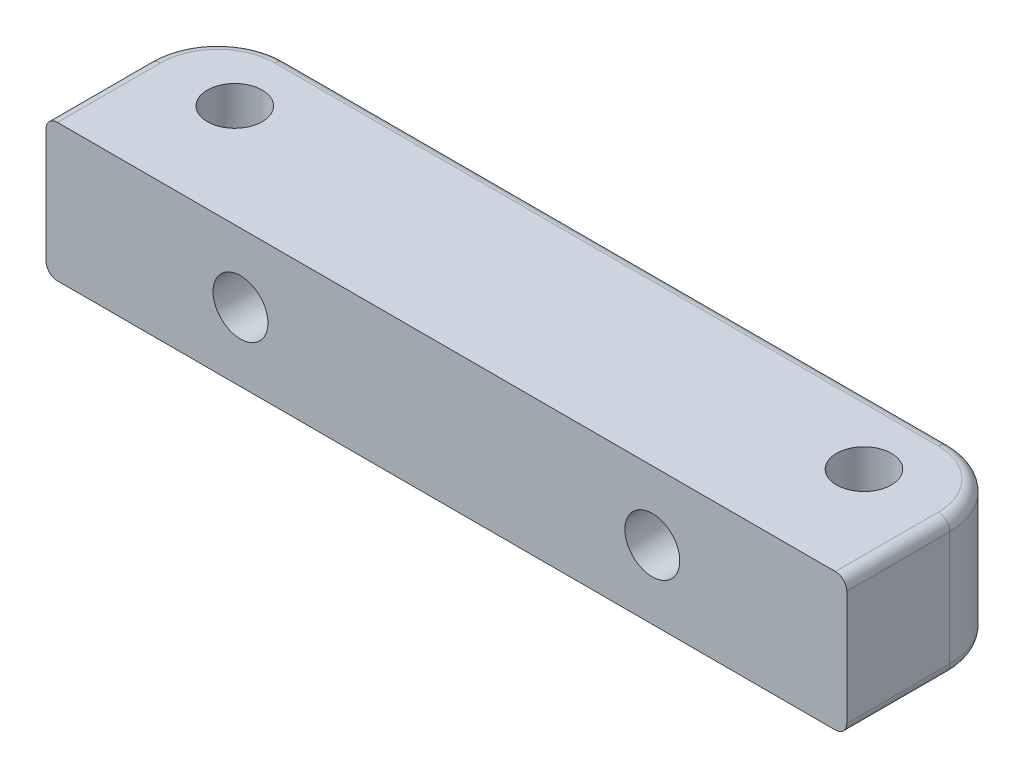
ISO-10303-21;
HEADER;
FILE_DESCRIPTION(('STEP AP214'),'2;1');
FILE_NAME('part.step','',(''),(''),'','','');
FILE_SCHEMA(('AUTOMOTIVE_DESIGN { 1 0 10303 214 1 1 1 1 }'));
ENDSEC;
DATA;
#1=APPLICATION_CONTEXT('core data for automotive mechanical design processes');
#2=APPLICATION_PROTOCOL_DEFINITION('international standard','automotive_design',2000,#1);
#3=PRODUCT_CONTEXT('',#1,'mechanical');
#4=PRODUCT('Part','Part','',(#3));
#5=PRODUCT_RELATED_PRODUCT_CATEGORY('part','',(#4));
#6=PRODUCT_DEFINITION_FORMATION('','',#4);
#7=PRODUCT_DEFINITION_CONTEXT('part definition',#1,'design');
#8=PRODUCT_DEFINITION('design','',#6,#7);
#9=PRODUCT_DEFINITION_SHAPE('','',#8);
#10=(LENGTH_UNIT() NAMED_UNIT(*) SI_UNIT(.MILLI.,.METRE.));
#11=(NAMED_UNIT(*) PLANE_ANGLE_UNIT() SI_UNIT($,.RADIAN.));
#12=(NAMED_UNIT(*) SI_UNIT($,.STERADIAN.) SOLID_ANGLE_UNIT());
#13=UNCERTAINTY_MEASURE_WITH_UNIT(LENGTH_MEASURE(1.E-05),#10,'distance_accuracy_value','');
#14=(GEOMETRIC_REPRESENTATION_CONTEXT(3) GLOBAL_UNCERTAINTY_ASSIGNED_CONTEXT((#13)) GLOBAL_UNIT_ASSIGNED_CONTEXT((#10,
#11,#12)) REPRESENTATION_CONTEXT('',''));
#15=CARTESIAN_POINT('',(0.,0.,0.));
#16=DIRECTION('',(0.,0.,1.));
#17=DIRECTION('',(1.,0.,0.));
#18=AXIS2_PLACEMENT_3D('',#15,#16,#17);
#19=CARTESIAN_POINT('',(-18.,0.,-7.50000000000001));
#20=DIRECTION('',(0.,0.,1.));
#21=DIRECTION('',(1.,0.,0.));
#22=AXIS2_PLACEMENT_3D('',#19,#20,#21);
#23=CYLINDRICAL_SURFACE('',#22,2.4);
#24=CARTESIAN_POINT('',(-18.,0.,7.5));
#25=DIRECTION('',(0.,0.,1.));
#26=DIRECTION('',(1.,0.,0.));
#27=AXIS2_PLACEMENT_3D('',#24,#25,#26);
#28=CIRCLE('',#27,2.4);
#29=CARTESIAN_POINT('',(-15.6,0.,7.5));
#30=VERTEX_POINT('',#29);
#31=EDGE_CURVE('E261',#30,#30,#28,.T.);
#32=ORIENTED_EDGE('',*,*,#31,.T.);
#33=EDGE_LOOP('',(#32));
#34=FACE_BOUND('',#33,.T.);
#35=CARTESIAN_POINT('',(-18.,0.,-2.5));
#36=DIRECTION('',(0.,0.,-1.));
#37=DIRECTION('',(-1.,0.,0.));
#38=AXIS2_PLACEMENT_3D('',#35,#36,#37);
#39=CIRCLE('',#38,2.4);
#40=CARTESIAN_POINT('',(-20.4,0.,-2.5));
#41=VERTEX_POINT('',#40);
#42=EDGE_CURVE('E228',#41,#41,#39,.F.);
#43=ORIENTED_EDGE('',*,*,#42,.F.);
#44=EDGE_LOOP('',(#43));
#45=FACE_BOUND('',#44,.T.);
#46=ADVANCED_FACE('F33',(#34,#45),#23,.F.);
#47=CARTESIAN_POINT('',(18.,0.,-7.50000000000001));
#48=DIRECTION('',(0.,0.,1.));
#49=DIRECTION('',(1.,0.,0.));
#50=AXIS2_PLACEMENT_3D('',#47,#48,#49);
#51=CYLINDRICAL_SURFACE('',#50,2.4);
#52=CARTESIAN_POINT('',(18.,0.,7.5));
#53=DIRECTION('',(0.,0.,1.));
#54=DIRECTION('',(-1.,0.,0.));
#55=AXIS2_PLACEMENT_3D('',#52,#53,#54);
#56=CIRCLE('',#55,2.4);
#57=CARTESIAN_POINT('',(15.6,0.,7.5));
#58=VERTEX_POINT('',#57);
#59=EDGE_CURVE('E214',#58,#58,#56,.T.);
#60=ORIENTED_EDGE('',*,*,#59,.T.);
#61=EDGE_LOOP('',(#60));
#62=FACE_BOUND('',#61,.T.);
#63=CARTESIAN_POINT('',(18.,0.,-2.5));
#64=DIRECTION('',(0.,0.,-1.));
#65=DIRECTION('',(-1.,0.,0.));
#66=AXIS2_PLACEMENT_3D('',#63,#64,#65);
#67=CIRCLE('',#66,2.4);
#68=CARTESIAN_POINT('',(15.6,0.,-2.5));
#69=VERTEX_POINT('',#68);
#70=EDGE_CURVE('E217',#69,#69,#67,.F.);
#71=ORIENTED_EDGE('',*,*,#70,.F.);
#72=EDGE_LOOP('',(#71));
#73=FACE_BOUND('',#72,.T.);
#74=ADVANCED_FACE('F342',(#62,#73),#51,.F.);
#75=CARTESIAN_POINT('',(0.,6.,0.));
#76=DIRECTION('',(0.,1.,0.));
#77=DIRECTION('',(0.,0.,1.));
#78=AXIS2_PLACEMENT_3D('',#75,#76,#77);
#79=PLANE('',#78);
#80=DIRECTION('',(1.,0.,0.));
#81=VECTOR('',#80,1.);
#82=CARTESIAN_POINT('',(35.,6.,7.49999999999999));
#83=LINE('',#82,#81);
#84=CARTESIAN_POINT('',(-34.,6.,7.5));
#85=VERTEX_POINT('',#84);
#86=CARTESIAN_POINT('',(34.,6.,7.49999999999999));
#87=VERTEX_POINT('',#86);
#88=EDGE_CURVE('E277',#85,#87,#83,.T.);
#89=ORIENTED_EDGE('',*,*,#88,.T.);
#90=DIRECTION('',(0.,0.,-1.));
#91=VECTOR('',#90,1.);
#92=CARTESIAN_POINT('',(34.,6.,-1.50000000000001));
#93=LINE('',#92,#91);
#94=CARTESIAN_POINT('',(34.,6.,-1.50000000000001));
#95=VERTEX_POINT('',#94);
#96=EDGE_CURVE('E199',#87,#95,#93,.T.);
#97=ORIENTED_EDGE('',*,*,#96,.T.);
#98=CARTESIAN_POINT('',(29.,6.,-1.50000000000001));
#99=DIRECTION('',(0.,1.,0.));
#100=DIRECTION('',(0.,0.,1.));
#101=AXIS2_PLACEMENT_3D('',#98,#99,#100);
#102=CIRCLE('',#101,5.);
#103=CARTESIAN_POINT('',(29.,6.,-6.50000000000001));
#104=VERTEX_POINT('',#103);
#105=EDGE_CURVE('E197',#95,#104,#102,.T.);
#106=ORIENTED_EDGE('',*,*,#105,.T.);
#107=DIRECTION('',(-1.,0.,0.));
#108=VECTOR('',#107,1.);
#109=CARTESIAN_POINT('',(-29.,6.,-6.5));
#110=LINE('',#109,#108);
#111=CARTESIAN_POINT('',(-29.,6.,-6.5));
#112=VERTEX_POINT('',#111);
#113=EDGE_CURVE('E192',#104,#112,#110,.T.);
#114=ORIENTED_EDGE('',*,*,#113,.T.);
#115=CARTESIAN_POINT('',(-29.,6.,-1.5));
#116=DIRECTION('',(0.,1.,0.));
#117=DIRECTION('',(0.,0.,1.));
#118=AXIS2_PLACEMENT_3D('',#115,#116,#117);
#119=CIRCLE('',#118,5.);
#120=CARTESIAN_POINT('',(-34.,6.,-1.5));
#121=VERTEX_POINT('',#120);
#122=EDGE_CURVE('E56',#112,#121,#119,.T.);
#123=ORIENTED_EDGE('',*,*,#122,.T.);
#124=DIRECTION('',(0.,0.,1.));
#125=VECTOR('',#124,1.);
#126=CARTESIAN_POINT('',(-34.,6.,7.5));
#127=LINE('',#126,#125);
#128=EDGE_CURVE('E195',#121,#85,#127,.T.);
#129=ORIENTED_EDGE('',*,*,#128,.T.);
#130=EDGE_LOOP('',(#89,#97,#106,#114,#123,#129));
#131=FACE_BOUND('',#130,.T.);
#132=CARTESIAN_POINT('',(-27.5,6.,-1.5));
#133=DIRECTION('',(0.,1.,0.));
#134=DIRECTION('',(0.,0.,1.));
#135=AXIS2_PLACEMENT_3D('',#132,#133,#134);
#136=CIRCLE('',#135,2.4);
#137=CARTESIAN_POINT('',(-27.5,6.,0.9));
#138=VERTEX_POINT('',#137);
#139=EDGE_CURVE('E271',#138,#138,#136,.T.);
#140=ORIENTED_EDGE('',*,*,#139,.F.);
#141=EDGE_LOOP('',(#140));
#142=FACE_BOUND('',#141,.T.);
#143=CARTESIAN_POINT('',(27.5,6.,-1.50000000000001));
#144=DIRECTION('',(0.,1.,0.));
#145=DIRECTION('',(0.,0.,-1.));
#146=AXIS2_PLACEMENT_3D('',#143,#144,#145);
#147=CIRCLE('',#146,2.4);
#148=CARTESIAN_POINT('',(27.5,6.,-3.90000000000001));
#149=VERTEX_POINT('',#148);
#150=EDGE_CURVE('E265',#149,#149,#147,.T.);
#151=ORIENTED_EDGE('',*,*,#150,.F.);
#152=EDGE_LOOP('',(#151));
#153=FACE_BOUND('',#152,.T.);
#154=ADVANCED_FACE('F322',(#131,#142,#153),#79,.T.);
#155=CARTESIAN_POINT('',(0.,-6.,0.));
#156=DIRECTION('',(0.,1.,0.));
#157=DIRECTION('',(0.,0.,1.));
#158=AXIS2_PLACEMENT_3D('',#155,#156,#157);
#159=PLANE('',#158);
#160=CARTESIAN_POINT('',(29.,-6.,-1.50000000000001));
#161=DIRECTION('',(0.,1.,0.));
#162=DIRECTION('',(0.,0.,1.));
#163=AXIS2_PLACEMENT_3D('',#160,#161,#162);
#164=CIRCLE('',#163,5.);
#165=CARTESIAN_POINT('',(29.,-6.,-6.50000000000001));
#166=VERTEX_POINT('',#165);
#167=CARTESIAN_POINT('',(34.,-6.,-1.50000000000001));
#168=VERTEX_POINT('',#167);
#169=EDGE_CURVE('E173',#166,#168,#164,.F.);
#170=ORIENTED_EDGE('',*,*,#169,.T.);
#171=DIRECTION('',(0.,0.,-1.));
#172=VECTOR('',#171,1.);
#173=CARTESIAN_POINT('',(34.,-6.,0.));
#174=LINE('',#173,#172);
#175=CARTESIAN_POINT('',(34.,-6.,7.49999999999999));
#176=VERTEX_POINT('',#175);
#177=EDGE_CURVE('E131',#168,#176,#174,.F.);
#178=ORIENTED_EDGE('',*,*,#177,.T.);
#179=DIRECTION('',(1.,0.,0.));
#180=VECTOR('',#179,1.);
#181=CARTESIAN_POINT('',(35.,-6.,7.49999999999999));
#182=LINE('',#181,#180);
#183=CARTESIAN_POINT('',(-34.,-6.,7.5));
#184=VERTEX_POINT('',#183);
#185=EDGE_CURVE('E274',#184,#176,#182,.T.);
#186=ORIENTED_EDGE('',*,*,#185,.F.);
#187=DIRECTION('',(0.,0.,1.));
#188=VECTOR('',#187,1.);
#189=CARTESIAN_POINT('',(-34.,-6.,0.));
#190=LINE('',#189,#188);
#191=CARTESIAN_POINT('',(-34.,-6.,-1.5));
#192=VERTEX_POINT('',#191);
#193=EDGE_CURVE('E171',#184,#192,#190,.F.);
#194=ORIENTED_EDGE('',*,*,#193,.T.);
#195=CARTESIAN_POINT('',(-29.,-6.,-1.5));
#196=DIRECTION('',(0.,1.,0.));
#197=DIRECTION('',(0.,0.,1.));
#198=AXIS2_PLACEMENT_3D('',#195,#196,#197);
#199=CIRCLE('',#198,5.);
#200=CARTESIAN_POINT('',(-29.,-6.,-6.5));
#201=VERTEX_POINT('',#200);
#202=EDGE_CURVE('E169',#192,#201,#199,.F.);
#203=ORIENTED_EDGE('',*,*,#202,.T.);
#204=DIRECTION('',(-1.,0.,0.));
#205=VECTOR('',#204,1.);
#206=CARTESIAN_POINT('',(0.,-6.,-6.5));
#207=LINE('',#206,#205);
#208=EDGE_CURVE('E155',#201,#166,#207,.F.);
#209=ORIENTED_EDGE('',*,*,#208,.T.);
#210=EDGE_LOOP('',(#170,#178,#186,#194,#203,#209));
#211=FACE_BOUND('',#210,.T.);
#212=CARTESIAN_POINT('',(-27.5,-6.,-1.5));
#213=DIRECTION('',(0.,1.,0.));
#214=DIRECTION('',(0.,0.,1.));
#215=AXIS2_PLACEMENT_3D('',#212,#213,#214);
#216=CIRCLE('',#215,2.4);
#217=CARTESIAN_POINT('',(-27.5,-6.,0.9));
#218=VERTEX_POINT('',#217);
#219=EDGE_CURVE('E268',#218,#218,#216,.T.);
#220=ORIENTED_EDGE('',*,*,#219,.T.);
#221=EDGE_LOOP('',(#220));
#222=FACE_BOUND('',#221,.T.);
#223=CARTESIAN_POINT('',(27.5,-6.,-1.50000000000001));
#224=DIRECTION('',(0.,1.,0.));
#225=DIRECTION('',(0.,0.,-1.));
#226=AXIS2_PLACEMENT_3D('',#223,#224,#225);
#227=CIRCLE('',#226,2.4);
#228=CARTESIAN_POINT('',(27.5,-6.,-3.90000000000001));
#229=VERTEX_POINT('',#228);
#230=EDGE_CURVE('E264',#229,#229,#227,.T.);
#231=ORIENTED_EDGE('',*,*,#230,.T.);
#232=EDGE_LOOP('',(#231));
#233=FACE_BOUND('',#232,.T.);
#234=ADVANCED_FACE('F319',(#211,#222,#233),#159,.F.);
#235=CARTESIAN_POINT('',(-35.,6.,7.5));
#236=DIRECTION('',(1.,0.,0.));
#237=DIRECTION('',(0.,0.,-1.));
#238=AXIS2_PLACEMENT_3D('',#235,#236,#237);
#239=PLANE('',#238);
#240=DIRECTION('',(0.,-1.,0.));
#241=VECTOR('',#240,1.);
#242=CARTESIAN_POINT('',(-35.,6.,-1.5));
#243=LINE('',#242,#241);
#244=CARTESIAN_POINT('',(-35.,5.,-1.5));
#245=VERTEX_POINT('',#244);
#246=CARTESIAN_POINT('',(-35.,-5.,-1.5));
#247=VERTEX_POINT('',#246);
#248=EDGE_CURVE('E286',#245,#247,#243,.T.);
#249=ORIENTED_EDGE('',*,*,#248,.T.);
#250=DIRECTION('',(0.,0.,1.));
#251=VECTOR('',#250,1.);
#252=CARTESIAN_POINT('',(-35.,-5.,7.5));
#253=LINE('',#252,#251);
#254=CARTESIAN_POINT('',(-35.,-5.,7.5));
#255=VERTEX_POINT('',#254);
#256=EDGE_CURVE('E186',#247,#255,#253,.T.);
#257=ORIENTED_EDGE('',*,*,#256,.T.);
#258=DIRECTION('',(0.,-1.,0.));
#259=VECTOR('',#258,1.);
#260=CARTESIAN_POINT('',(-35.,6.,7.5));
#261=LINE('',#260,#259);
#262=CARTESIAN_POINT('',(-35.,5.,7.5));
#263=VERTEX_POINT('',#262);
#264=EDGE_CURVE('E283',#263,#255,#261,.T.);
#265=ORIENTED_EDGE('',*,*,#264,.F.);
#266=DIRECTION('',(0.,0.,1.));
#267=VECTOR('',#266,1.);
#268=CARTESIAN_POINT('',(-35.,5.,-1.5));
#269=LINE('',#268,#267);
#270=EDGE_CURVE('E145',#263,#245,#269,.F.);
#271=ORIENTED_EDGE('',*,*,#270,.T.);
#272=EDGE_LOOP('',(#249,#257,#265,#271));
#273=FACE_BOUND('',#272,.T.);
#274=ADVANCED_FACE('F308',(#273),#239,.F.);
#275=CARTESIAN_POINT('',(35.,6.,7.49999999999999));
#276=DIRECTION('',(0.,0.,-1.));
#277=DIRECTION('',(-1.,0.,0.));
#278=AXIS2_PLACEMENT_3D('',#275,#276,#277);
#279=PLANE('',#278);
#280=ORIENTED_EDGE('',*,*,#59,.F.);
#281=EDGE_LOOP('',(#280));
#282=FACE_BOUND('',#281,.T.);
#283=ORIENTED_EDGE('',*,*,#31,.F.);
#284=EDGE_LOOP('',(#283));
#285=FACE_BOUND('',#284,.T.);
#286=ORIENTED_EDGE('',*,*,#185,.T.);
#287=CARTESIAN_POINT('',(34.,-5.,7.49999999999999));
#288=DIRECTION('',(0.,0.,-1.));
#289=DIRECTION('',(-1.,0.,0.));
#290=AXIS2_PLACEMENT_3D('',#287,#288,#289);
#291=CIRCLE('',#290,1.);
#292=CARTESIAN_POINT('',(35.,-5.,7.49999999999999));
#293=VERTEX_POINT('',#292);
#294=EDGE_CURVE('E182',#176,#293,#291,.F.);
#295=ORIENTED_EDGE('',*,*,#294,.T.);
#296=DIRECTION('',(0.,-1.,0.));
#297=VECTOR('',#296,1.);
#298=CARTESIAN_POINT('',(35.,6.,7.49999999999999));
#299=LINE('',#298,#297);
#300=CARTESIAN_POINT('',(35.,5.,7.49999999999999));
#301=VERTEX_POINT('',#300);
#302=EDGE_CURVE('E154',#301,#293,#299,.T.);
#303=ORIENTED_EDGE('',*,*,#302,.F.);
#304=CARTESIAN_POINT('',(34.,5.,7.49999999999999));
#305=DIRECTION('',(0.,0.,-1.));
#306=DIRECTION('',(-1.,0.,0.));
#307=AXIS2_PLACEMENT_3D('',#304,#305,#306);
#308=CIRCLE('',#307,1.);
#309=EDGE_CURVE('E178',#301,#87,#308,.F.);
#310=ORIENTED_EDGE('',*,*,#309,.T.);
#311=ORIENTED_EDGE('',*,*,#88,.F.);
#312=CARTESIAN_POINT('',(-34.,5.,7.5));
#313=DIRECTION('',(0.,0.,-1.));
#314=DIRECTION('',(-1.,0.,0.));
#315=AXIS2_PLACEMENT_3D('',#312,#313,#314);
#316=CIRCLE('',#315,1.);
#317=EDGE_CURVE('E176',#85,#263,#316,.F.);
#318=ORIENTED_EDGE('',*,*,#317,.T.);
#319=ORIENTED_EDGE('',*,*,#264,.T.);
#320=CARTESIAN_POINT('',(-34.,-5.,7.5));
#321=DIRECTION('',(0.,0.,-1.));
#322=DIRECTION('',(-1.,0.,0.));
#323=AXIS2_PLACEMENT_3D('',#320,#321,#322);
#324=CIRCLE('',#323,1.);
#325=EDGE_CURVE('E180',#255,#184,#324,.F.);
#326=ORIENTED_EDGE('',*,*,#325,.T.);
#327=EDGE_LOOP('',(#286,#295,#303,#310,#311,#318,#319,#326));
#328=FACE_BOUND('',#327,.T.);
#329=ADVANCED_FACE('F317',(#282,#285,#328),#279,.F.);
#330=CARTESIAN_POINT('',(35.,6.,7.49999999999999));
#331=DIRECTION('',(-1.,0.,0.));
#332=DIRECTION('',(0.,0.,1.));
#333=AXIS2_PLACEMENT_3D('',#330,#331,#332);
#334=PLANE('',#333);
#335=ORIENTED_EDGE('',*,*,#302,.T.);
#336=DIRECTION('',(0.,0.,-1.));
#337=VECTOR('',#336,1.);
#338=CARTESIAN_POINT('',(35.,-5.,7.49999999999999));
#339=LINE('',#338,#337);
#340=CARTESIAN_POINT('',(35.,-5.,-1.50000000000001));
#341=VERTEX_POINT('',#340);
#342=EDGE_CURVE('E130',#293,#341,#339,.T.);
#343=ORIENTED_EDGE('',*,*,#342,.T.);
#344=DIRECTION('',(0.,-1.,0.));
#345=VECTOR('',#344,1.);
#346=CARTESIAN_POINT('',(35.,6.,-1.50000000000001));
#347=LINE('',#346,#345);
#348=CARTESIAN_POINT('',(35.,5.,-1.50000000000001));
#349=VERTEX_POINT('',#348);
#350=EDGE_CURVE('E152',#341,#349,#347,.F.);
#351=ORIENTED_EDGE('',*,*,#350,.T.);
#352=DIRECTION('',(0.,0.,-1.));
#353=VECTOR('',#352,1.);
#354=CARTESIAN_POINT('',(35.,5.,7.49999999999999));
#355=LINE('',#354,#353);
#356=EDGE_CURVE('E156',#349,#301,#355,.F.);
#357=ORIENTED_EDGE('',*,*,#356,.T.);
#358=EDGE_LOOP('',(#335,#343,#351,#357));
#359=FACE_BOUND('',#358,.T.);
#360=ADVANCED_FACE('F151',(#359),#334,.F.);
#361=CARTESIAN_POINT('',(35.,6.,-7.50000000000001));
#362=DIRECTION('',(0.,0.,1.));
#363=DIRECTION('',(1.,0.,0.));
#364=AXIS2_PLACEMENT_3D('',#361,#362,#363);
#365=PLANE('',#364);
#366=CARTESIAN_POINT('',(-18.,0.,-7.5));
#367=DIRECTION('',(0.,0.,1.));
#368=DIRECTION('',(1.,0.,0.));
#369=AXIS2_PLACEMENT_3D('',#366,#367,#368);
#370=CIRCLE('',#369,4.9);
#371=CARTESIAN_POINT('',(-13.1,0.,-7.5));
#372=VERTEX_POINT('',#371);
#373=EDGE_CURVE('E41',#372,#372,#370,.T.);
#374=ORIENTED_EDGE('',*,*,#373,.T.);
#375=EDGE_LOOP('',(#374));
#376=FACE_BOUND('',#375,.T.);
#377=CARTESIAN_POINT('',(18.,0.,-7.50000000000001));
#378=DIRECTION('',(0.,0.,1.));
#379=DIRECTION('',(1.,0.,0.));
#380=AXIS2_PLACEMENT_3D('',#377,#378,#379);
#381=CIRCLE('',#380,4.9);
#382=CARTESIAN_POINT('',(22.9,0.,-7.50000000000001));
#383=VERTEX_POINT('',#382);
#384=EDGE_CURVE('E234',#383,#383,#381,.T.);
#385=ORIENTED_EDGE('',*,*,#384,.T.);
#386=EDGE_LOOP('',(#385));
#387=FACE_BOUND('',#386,.T.);
#388=DIRECTION('',(0.,-1.,0.));
#389=VECTOR('',#388,1.);
#390=CARTESIAN_POINT('',(29.,6.,-7.50000000000001));
#391=LINE('',#390,#389);
#392=CARTESIAN_POINT('',(29.,5.,-7.50000000000001));
#393=VERTEX_POINT('',#392);
#394=CARTESIAN_POINT('',(29.,-5.,-7.50000000000001));
#395=VERTEX_POINT('',#394);
#396=EDGE_CURVE('E164',#393,#395,#391,.T.);
#397=ORIENTED_EDGE('',*,*,#396,.T.);
#398=DIRECTION('',(-1.,0.,0.));
#399=VECTOR('',#398,1.);
#400=CARTESIAN_POINT('',(35.,-5.,-7.50000000000001));
#401=LINE('',#400,#399);
#402=CARTESIAN_POINT('',(-29.,-5.,-7.5));
#403=VERTEX_POINT('',#402);
#404=EDGE_CURVE('E204',#395,#403,#401,.T.);
#405=ORIENTED_EDGE('',*,*,#404,.T.);
#406=DIRECTION('',(0.,-1.,0.));
#407=VECTOR('',#406,1.);
#408=CARTESIAN_POINT('',(-29.,6.,-7.5));
#409=LINE('',#408,#407);
#410=CARTESIAN_POINT('',(-29.,5.,-7.5));
#411=VERTEX_POINT('',#410);
#412=EDGE_CURVE('E160',#403,#411,#409,.F.);
#413=ORIENTED_EDGE('',*,*,#412,.T.);
#414=DIRECTION('',(-1.,0.,0.));
#415=VECTOR('',#414,1.);
#416=CARTESIAN_POINT('',(29.,5.,-7.50000000000001));
#417=LINE('',#416,#415);
#418=EDGE_CURVE('E202',#411,#393,#417,.F.);
#419=ORIENTED_EDGE('',*,*,#418,.T.);
#420=EDGE_LOOP('',(#397,#405,#413,#419));
#421=FACE_BOUND('',#420,.T.);
#422=ADVANCED_FACE('F239',(#376,#387,#421),#365,.F.);
#423=CARTESIAN_POINT('',(-27.5,6.,-1.5));
#424=DIRECTION('',(0.,-1.,0.));
#425=DIRECTION('',(0.,0.,-1.));
#426=AXIS2_PLACEMENT_3D('',#423,#424,#425);
#427=CYLINDRICAL_SURFACE('',#426,2.4);
#428=ORIENTED_EDGE('',*,*,#139,.T.);
#429=EDGE_LOOP('',(#428));
#430=FACE_BOUND('',#429,.T.);
#431=ORIENTED_EDGE('',*,*,#219,.F.);
#432=EDGE_LOOP('',(#431));
#433=FACE_BOUND('',#432,.T.);
#434=ADVANCED_FACE('F330',(#430,#433),#427,.F.);
#435=CARTESIAN_POINT('',(27.5,6.,-1.50000000000001));
#436=DIRECTION('',(0.,-1.,0.));
#437=DIRECTION('',(0.,0.,-1.));
#438=AXIS2_PLACEMENT_3D('',#435,#436,#437);
#439=CYLINDRICAL_SURFACE('',#438,2.4);
#440=ORIENTED_EDGE('',*,*,#150,.T.);
#441=EDGE_LOOP('',(#440));
#442=FACE_BOUND('',#441,.T.);
#443=ORIENTED_EDGE('',*,*,#230,.F.);
#444=EDGE_LOOP('',(#443));
#445=FACE_BOUND('',#444,.T.);
#446=ADVANCED_FACE('F328',(#442,#445),#439,.F.);
#447=CARTESIAN_POINT('',(-29.,6.,-1.5));
#448=DIRECTION('',(0.,-1.,0.));
#449=DIRECTION('',(0.,0.,-1.));
#450=AXIS2_PLACEMENT_3D('',#447,#448,#449);
#451=CYLINDRICAL_SURFACE('',#450,6.);
#452=ORIENTED_EDGE('',*,*,#412,.F.);
#453=CARTESIAN_POINT('',(-29.,-5.,-1.5));
#454=DIRECTION('',(0.,1.,0.));
#455=DIRECTION('',(0.,0.,1.));
#456=AXIS2_PLACEMENT_3D('',#453,#454,#455);
#457=CIRCLE('',#456,6.);
#458=EDGE_CURVE('E190',#403,#247,#457,.T.);
#459=ORIENTED_EDGE('',*,*,#458,.T.);
#460=ORIENTED_EDGE('',*,*,#248,.F.);
#461=CARTESIAN_POINT('',(-29.,5.,-1.5));
#462=DIRECTION('',(0.,1.,0.));
#463=DIRECTION('',(0.,0.,1.));
#464=AXIS2_PLACEMENT_3D('',#461,#462,#463);
#465=CIRCLE('',#464,6.);
#466=EDGE_CURVE('E188',#245,#411,#465,.F.);
#467=ORIENTED_EDGE('',*,*,#466,.T.);
#468=EDGE_LOOP('',(#452,#459,#460,#467));
#469=FACE_BOUND('',#468,.T.);
#470=ADVANCED_FACE('F304',(#469),#451,.T.);
#471=CARTESIAN_POINT('',(29.,6.,-1.50000000000001));
#472=DIRECTION('',(0.,-1.,0.));
#473=DIRECTION('',(0.,0.,-1.));
#474=AXIS2_PLACEMENT_3D('',#471,#472,#473);
#475=CYLINDRICAL_SURFACE('',#474,6.);
#476=ORIENTED_EDGE('',*,*,#350,.F.);
#477=CARTESIAN_POINT('',(29.,-5.,-1.50000000000001));
#478=DIRECTION('',(0.,1.,0.));
#479=DIRECTION('',(0.,0.,1.));
#480=AXIS2_PLACEMENT_3D('',#477,#478,#479);
#481=CIRCLE('',#480,6.);
#482=EDGE_CURVE('E138',#341,#395,#481,.T.);
#483=ORIENTED_EDGE('',*,*,#482,.T.);
#484=ORIENTED_EDGE('',*,*,#396,.F.);
#485=CARTESIAN_POINT('',(29.,5.,-1.50000000000001));
#486=DIRECTION('',(0.,1.,0.));
#487=DIRECTION('',(0.,0.,1.));
#488=AXIS2_PLACEMENT_3D('',#485,#486,#487);
#489=CIRCLE('',#488,6.);
#490=EDGE_CURVE('E146',#393,#349,#489,.F.);
#491=ORIENTED_EDGE('',*,*,#490,.T.);
#492=EDGE_LOOP('',(#476,#483,#484,#491));
#493=FACE_BOUND('',#492,.T.);
#494=ADVANCED_FACE('F158',(#493),#475,.T.);
#495=CARTESIAN_POINT('',(-34.,-5.,7.5));
#496=DIRECTION('',(0.,0.,1.));
#497=DIRECTION('',(1.,0.,0.));
#498=AXIS2_PLACEMENT_3D('',#495,#496,#497);
#499=CYLINDRICAL_SURFACE('',#498,1.);
#500=ORIENTED_EDGE('',*,*,#325,.F.);
#501=ORIENTED_EDGE('',*,*,#256,.F.);
#502=CARTESIAN_POINT('',(-34.,-5.,-1.5));
#503=DIRECTION('',(0.,0.,-1.));
#504=DIRECTION('',(-1.,0.,0.));
#505=AXIS2_PLACEMENT_3D('',#502,#503,#504);
#506=CIRCLE('',#505,1.);
#507=EDGE_CURVE('E211',#192,#247,#506,.T.);
#508=ORIENTED_EDGE('',*,*,#507,.F.);
#509=ORIENTED_EDGE('',*,*,#193,.F.);
#510=EDGE_LOOP('',(#500,#501,#508,#509));
#511=FACE_BOUND('',#510,.T.);
#512=ADVANCED_FACE('F313',(#511),#499,.T.);
#513=CARTESIAN_POINT('',(-29.,-5.,-1.5));
#514=DIRECTION('',(0.,1.,0.));
#515=DIRECTION('',(0.,0.,1.));
#516=AXIS2_PLACEMENT_3D('',#513,#514,#515);
#517=TOROIDAL_SURFACE('',#516,5.,1.);
#518=ORIENTED_EDGE('',*,*,#507,.T.);
#519=ORIENTED_EDGE('',*,*,#458,.F.);
#520=CARTESIAN_POINT('',(-29.,-5.,-6.5));
#521=DIRECTION('',(1.,0.,0.));
#522=DIRECTION('',(0.,0.,-1.));
#523=AXIS2_PLACEMENT_3D('',#520,#521,#522);
#524=CIRCLE('',#523,1.);
#525=EDGE_CURVE('E208',#201,#403,#524,.T.);
#526=ORIENTED_EDGE('',*,*,#525,.F.);
#527=ORIENTED_EDGE('',*,*,#202,.F.);
#528=EDGE_LOOP('',(#518,#519,#526,#527));
#529=FACE_BOUND('',#528,.T.);
#530=ADVANCED_FACE('F300',(#529),#517,.T.);
#531=CARTESIAN_POINT('',(35.,-5.,-6.50000000000001));
#532=DIRECTION('',(-1.,0.,0.));
#533=DIRECTION('',(0.,0.,1.));
#534=AXIS2_PLACEMENT_3D('',#531,#532,#533);
#535=CYLINDRICAL_SURFACE('',#534,1.);
#536=ORIENTED_EDGE('',*,*,#525,.T.);
#537=ORIENTED_EDGE('',*,*,#404,.F.);
#538=CARTESIAN_POINT('',(29.,-5.,-6.50000000000001));
#539=DIRECTION('',(1.,0.,0.));
#540=DIRECTION('',(0.,0.,-1.));
#541=AXIS2_PLACEMENT_3D('',#538,#539,#540);
#542=CIRCLE('',#541,1.);
#543=EDGE_CURVE('E134',#166,#395,#542,.T.);
#544=ORIENTED_EDGE('',*,*,#543,.F.);
#545=ORIENTED_EDGE('',*,*,#208,.F.);
#546=EDGE_LOOP('',(#536,#537,#544,#545));
#547=FACE_BOUND('',#546,.T.);
#548=ADVANCED_FACE('F294',(#547),#535,.T.);
#549=CARTESIAN_POINT('',(29.,-5.,-1.50000000000001));
#550=DIRECTION('',(0.,1.,0.));
#551=DIRECTION('',(0.,0.,1.));
#552=AXIS2_PLACEMENT_3D('',#549,#550,#551);
#553=TOROIDAL_SURFACE('',#552,5.,1.);
#554=ORIENTED_EDGE('',*,*,#543,.T.);
#555=ORIENTED_EDGE('',*,*,#482,.F.);
#556=CARTESIAN_POINT('',(34.,-5.,-1.50000000000001));
#557=DIRECTION('',(0.,0.,1.));
#558=DIRECTION('',(1.,0.,0.));
#559=AXIS2_PLACEMENT_3D('',#556,#557,#558);
#560=CIRCLE('',#559,1.);
#561=EDGE_CURVE('E125',#168,#341,#560,.T.);
#562=ORIENTED_EDGE('',*,*,#561,.F.);
#563=ORIENTED_EDGE('',*,*,#169,.F.);
#564=EDGE_LOOP('',(#554,#555,#562,#563));
#565=FACE_BOUND('',#564,.T.);
#566=ADVANCED_FACE('F139',(#565),#553,.T.);
#567=CARTESIAN_POINT('',(34.,-5.,7.49999999999999));
#568=DIRECTION('',(0.,0.,-1.));
#569=DIRECTION('',(-1.,0.,0.));
#570=AXIS2_PLACEMENT_3D('',#567,#568,#569);
#571=CYLINDRICAL_SURFACE('',#570,1.);
#572=ORIENTED_EDGE('',*,*,#294,.F.);
#573=ORIENTED_EDGE('',*,*,#177,.F.);
#574=ORIENTED_EDGE('',*,*,#561,.T.);
#575=ORIENTED_EDGE('',*,*,#342,.F.);
#576=EDGE_LOOP('',(#572,#573,#574,#575));
#577=FACE_BOUND('',#576,.T.);
#578=ADVANCED_FACE('F128',(#577),#571,.T.);
#579=CARTESIAN_POINT('',(-34.,5.,0.));
#580=DIRECTION('',(0.,0.,-1.));
#581=DIRECTION('',(-1.,0.,0.));
#582=AXIS2_PLACEMENT_3D('',#579,#580,#581);
#583=CYLINDRICAL_SURFACE('',#582,1.);
#584=ORIENTED_EDGE('',*,*,#317,.F.);
#585=ORIENTED_EDGE('',*,*,#128,.F.);
#586=CARTESIAN_POINT('',(-34.,5.,-1.5));
#587=DIRECTION('',(0.,0.,-1.));
#588=DIRECTION('',(-1.,0.,0.));
#589=AXIS2_PLACEMENT_3D('',#586,#587,#588);
#590=CIRCLE('',#589,1.);
#591=EDGE_CURVE('E135',#245,#121,#590,.T.);
#592=ORIENTED_EDGE('',*,*,#591,.F.);
#593=ORIENTED_EDGE('',*,*,#270,.F.);
#594=EDGE_LOOP('',(#584,#585,#592,#593));
#595=FACE_BOUND('',#594,.T.);
#596=ADVANCED_FACE('F442',(#595),#583,.T.);
#597=CARTESIAN_POINT('',(-29.,5.,-1.5));
#598=DIRECTION('',(0.,1.,0.));
#599=DIRECTION('',(0.,0.,1.));
#600=AXIS2_PLACEMENT_3D('',#597,#598,#599);
#601=TOROIDAL_SURFACE('',#600,5.,1.);
#602=ORIENTED_EDGE('',*,*,#591,.T.);
#603=ORIENTED_EDGE('',*,*,#122,.F.);
#604=CARTESIAN_POINT('',(-29.,5.,-6.5));
#605=DIRECTION('',(1.,0.,0.));
#606=DIRECTION('',(0.,0.,-1.));
#607=AXIS2_PLACEMENT_3D('',#604,#605,#606);
#608=CIRCLE('',#607,1.);
#609=EDGE_CURVE('E220',#411,#112,#608,.T.);
#610=ORIENTED_EDGE('',*,*,#609,.F.);
#611=ORIENTED_EDGE('',*,*,#466,.F.);
#612=EDGE_LOOP('',(#602,#603,#610,#611));
#613=FACE_BOUND('',#612,.T.);
#614=ADVANCED_FACE('F433',(#613),#601,.T.);
#615=CARTESIAN_POINT('',(0.,5.,-6.5));
#616=DIRECTION('',(1.,0.,0.));
#617=DIRECTION('',(0.,0.,-1.));
#618=AXIS2_PLACEMENT_3D('',#615,#616,#617);
#619=CYLINDRICAL_SURFACE('',#618,1.);
#620=ORIENTED_EDGE('',*,*,#609,.T.);
#621=ORIENTED_EDGE('',*,*,#113,.F.);
#622=CARTESIAN_POINT('',(29.,5.,-6.50000000000001));
#623=DIRECTION('',(1.,0.,0.));
#624=DIRECTION('',(0.,0.,-1.));
#625=AXIS2_PLACEMENT_3D('',#622,#623,#624);
#626=CIRCLE('',#625,1.);
#627=EDGE_CURVE('E216',#393,#104,#626,.T.);
#628=ORIENTED_EDGE('',*,*,#627,.F.);
#629=ORIENTED_EDGE('',*,*,#418,.F.);
#630=EDGE_LOOP('',(#620,#621,#628,#629));
#631=FACE_BOUND('',#630,.T.);
#632=ADVANCED_FACE('F424',(#631),#619,.T.);
#633=CARTESIAN_POINT('',(29.,5.,-1.50000000000001));
#634=DIRECTION('',(0.,1.,0.));
#635=DIRECTION('',(0.,0.,1.));
#636=AXIS2_PLACEMENT_3D('',#633,#634,#635);
#637=TOROIDAL_SURFACE('',#636,5.,1.);
#638=ORIENTED_EDGE('',*,*,#627,.T.);
#639=ORIENTED_EDGE('',*,*,#105,.F.);
#640=CARTESIAN_POINT('',(34.,5.,-1.50000000000001));
#641=DIRECTION('',(0.,0.,1.));
#642=DIRECTION('',(0.,-1.,0.));
#643=AXIS2_PLACEMENT_3D('',#640,#641,#642);
#644=CIRCLE('',#643,1.);
#645=EDGE_CURVE('E48',#349,#95,#644,.T.);
#646=ORIENTED_EDGE('',*,*,#645,.F.);
#647=ORIENTED_EDGE('',*,*,#490,.F.);
#648=EDGE_LOOP('',(#638,#639,#646,#647));
#649=FACE_BOUND('',#648,.T.);
#650=ADVANCED_FACE('F416',(#649),#637,.T.);
#651=CARTESIAN_POINT('',(34.,5.,0.));
#652=DIRECTION('',(0.,0.,1.));
#653=DIRECTION('',(1.,0.,0.));
#654=AXIS2_PLACEMENT_3D('',#651,#652,#653);
#655=CYLINDRICAL_SURFACE('',#654,1.);
#656=ORIENTED_EDGE('',*,*,#309,.F.);
#657=ORIENTED_EDGE('',*,*,#356,.F.);
#658=ORIENTED_EDGE('',*,*,#645,.T.);
#659=ORIENTED_EDGE('',*,*,#96,.F.);
#660=EDGE_LOOP('',(#656,#657,#658,#659));
#661=FACE_BOUND('',#660,.T.);
#662=ADVANCED_FACE('F357',(#661),#655,.T.);
#663=CARTESIAN_POINT('',(18.,0.,-2.5));
#664=DIRECTION('',(0.,0.,-1.));
#665=DIRECTION('',(-1.,0.,0.));
#666=AXIS2_PLACEMENT_3D('',#663,#664,#665);
#667=PLANE('',#666);
#668=CARTESIAN_POINT('',(18.,0.,-2.5));
#669=DIRECTION('',(0.,0.,-1.));
#670=DIRECTION('',(-1.,0.,0.));
#671=AXIS2_PLACEMENT_3D('',#668,#669,#670);
#672=CIRCLE('',#671,4.5);
#673=CARTESIAN_POINT('',(13.5,0.,-2.5));
#674=VERTEX_POINT('',#673);
#675=EDGE_CURVE('E227',#674,#674,#672,.T.);
#676=ORIENTED_EDGE('',*,*,#675,.T.);
#677=EDGE_LOOP('',(#676));
#678=FACE_BOUND('',#677,.T.);
#679=ORIENTED_EDGE('',*,*,#70,.T.);
#680=EDGE_LOOP('',(#679));
#681=FACE_BOUND('',#680,.T.);
#682=ADVANCED_FACE('F354',(#678,#681),#667,.T.);
#683=CARTESIAN_POINT('',(18.,0.,-2.5));
#684=DIRECTION('',(0.,0.,-1.));
#685=DIRECTION('',(-1.,0.,0.));
#686=AXIS2_PLACEMENT_3D('',#683,#684,#685);
#687=CYLINDRICAL_SURFACE('',#686,4.5);
#688=CARTESIAN_POINT('',(18.,0.,-7.10000000000001));
#689=DIRECTION('',(0.,0.,1.));
#690=DIRECTION('',(1.,0.,0.));
#691=AXIS2_PLACEMENT_3D('',#688,#689,#690);
#692=CIRCLE('',#691,4.5);
#693=CARTESIAN_POINT('',(22.5,0.,-7.10000000000001));
#694=VERTEX_POINT('',#693);
#695=EDGE_CURVE('E11',#694,#694,#692,.F.);
#696=ORIENTED_EDGE('',*,*,#695,.T.);
#697=EDGE_LOOP('',(#696));
#698=FACE_BOUND('',#697,.T.);
#699=ORIENTED_EDGE('',*,*,#675,.F.);
#700=EDGE_LOOP('',(#699));
#701=FACE_BOUND('',#700,.T.);
#702=ADVANCED_FACE('F351',(#698,#701),#687,.F.);
#703=CARTESIAN_POINT('',(-18.,0.,-2.5));
#704=DIRECTION('',(0.,0.,-1.));
#705=DIRECTION('',(-1.,0.,0.));
#706=AXIS2_PLACEMENT_3D('',#703,#704,#705);
#707=PLANE('',#706);
#708=CARTESIAN_POINT('',(-18.,0.,-2.5));
#709=DIRECTION('',(0.,0.,-1.));
#710=DIRECTION('',(-1.,0.,0.));
#711=AXIS2_PLACEMENT_3D('',#708,#709,#710);
#712=CIRCLE('',#711,4.5);
#713=CARTESIAN_POINT('',(-22.5,0.,-2.5));
#714=VERTEX_POINT('',#713);
#715=EDGE_CURVE('E231',#714,#714,#712,.T.);
#716=ORIENTED_EDGE('',*,*,#715,.T.);
#717=EDGE_LOOP('',(#716));
#718=FACE_BOUND('',#717,.T.);
#719=ORIENTED_EDGE('',*,*,#42,.T.);
#720=EDGE_LOOP('',(#719));
#721=FACE_BOUND('',#720,.T.);
#722=ADVANCED_FACE('F250',(#718,#721),#707,.T.);
#723=CARTESIAN_POINT('',(-18.,0.,-2.5));
#724=DIRECTION('',(0.,0.,-1.));
#725=DIRECTION('',(-1.,0.,0.));
#726=AXIS2_PLACEMENT_3D('',#723,#724,#725);
#727=CYLINDRICAL_SURFACE('',#726,4.5);
#728=CARTESIAN_POINT('',(-18.,0.,-7.10000000000001));
#729=DIRECTION('',(0.,0.,1.));
#730=DIRECTION('',(1.,0.,0.));
#731=AXIS2_PLACEMENT_3D('',#728,#729,#730);
#732=CIRCLE('',#731,4.5);
#733=CARTESIAN_POINT('',(-13.5,0.,-7.10000000000001));
#734=VERTEX_POINT('',#733);
#735=EDGE_CURVE('E205',#734,#734,#732,.F.);
#736=ORIENTED_EDGE('',*,*,#735,.T.);
#737=EDGE_LOOP('',(#736));
#738=FACE_BOUND('',#737,.T.);
#739=ORIENTED_EDGE('',*,*,#715,.F.);
#740=EDGE_LOOP('',(#739));
#741=FACE_BOUND('',#740,.T.);
#742=ADVANCED_FACE('F245',(#738,#741),#727,.F.);
#743=CARTESIAN_POINT('',(-18.,0.,-7.10000000000001));
#744=DIRECTION('',(0.,0.,-1.));
#745=DIRECTION('',(-1.,0.,0.));
#746=AXIS2_PLACEMENT_3D('',#743,#744,#745);
#747=CONICAL_SURFACE('',#746,4.5,0.785398163397454);
#748=ORIENTED_EDGE('',*,*,#373,.F.);
#749=EDGE_LOOP('',(#748));
#750=FACE_BOUND('',#749,.T.);
#751=ORIENTED_EDGE('',*,*,#735,.F.);
#752=EDGE_LOOP('',(#751));
#753=FACE_BOUND('',#752,.T.);
#754=ADVANCED_FACE('F242',(#750,#753),#747,.F.);
#755=CARTESIAN_POINT('',(18.,0.,-7.10000000000001));
#756=DIRECTION('',(0.,0.,-1.));
#757=DIRECTION('',(-1.,0.,0.));
#758=AXIS2_PLACEMENT_3D('',#755,#756,#757);
#759=CONICAL_SURFACE('',#758,4.5,0.785398163397453);
#760=ORIENTED_EDGE('',*,*,#384,.F.);
#761=EDGE_LOOP('',(#760));
#762=FACE_BOUND('',#761,.T.);
#763=ORIENTED_EDGE('',*,*,#695,.F.);
#764=EDGE_LOOP('',(#763));
#765=FACE_BOUND('',#764,.T.);
#766=ADVANCED_FACE('F35',(#762,#765),#759,.F.);
#767=CLOSED_SHELL('',(#46,#74,#154,#234,#274,#329,#360,#422,#434,#446,#470,#494,#512,#530,#548,
#566,#578,#596,#614,#632,#650,#662,#682,#702,#722,#742,#754,#766));
#768=MANIFOLD_SOLID_BREP('B2',#767);
#769=ADVANCED_BREP_SHAPE_REPRESENTATION('',(#18,#768),#14);
#770=SHAPE_DEFINITION_REPRESENTATION(#9,#769);
ENDSEC;
END-ISO-10303-21;
